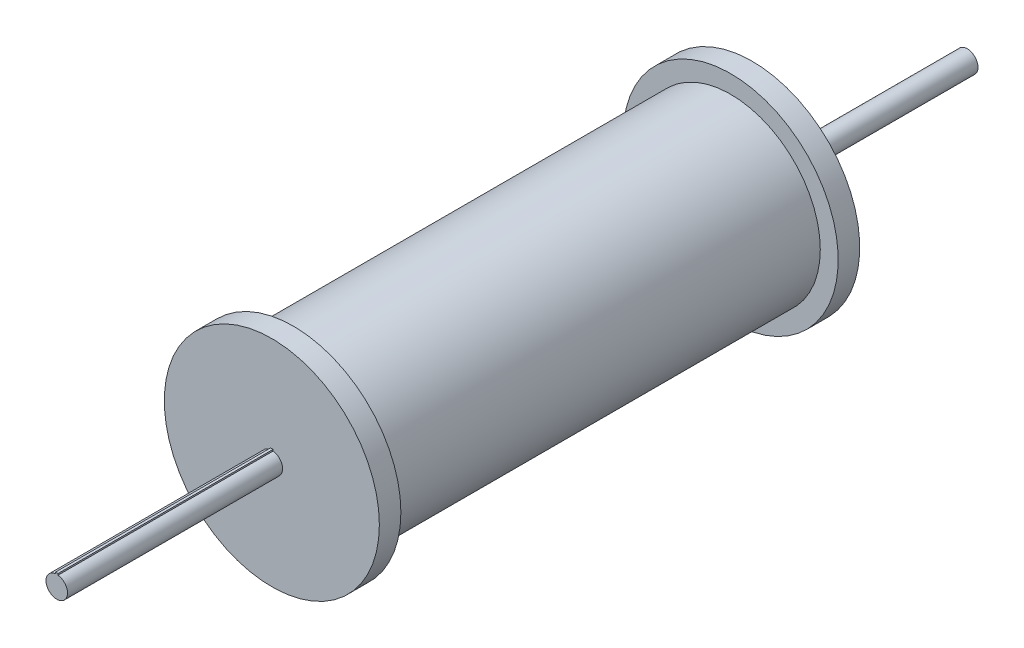
ISO-10303-21;
HEADER;
FILE_DESCRIPTION(('STEP AP214'),'2;1');
FILE_NAME('part.step','',(''),(''),'','','');
FILE_SCHEMA(('AUTOMOTIVE_DESIGN { 1 0 10303 214 1 1 1 1 }'));
ENDSEC;
DATA;
#1=APPLICATION_CONTEXT('core data for automotive mechanical design processes');
#2=APPLICATION_PROTOCOL_DEFINITION('international standard','automotive_design',2000,#1);
#3=PRODUCT_CONTEXT('',#1,'mechanical');
#4=PRODUCT('Part','Part','',(#3));
#5=PRODUCT_RELATED_PRODUCT_CATEGORY('part','',(#4));
#6=PRODUCT_DEFINITION_FORMATION('','',#4);
#7=PRODUCT_DEFINITION_CONTEXT('part definition',#1,'design');
#8=PRODUCT_DEFINITION('design','',#6,#7);
#9=PRODUCT_DEFINITION_SHAPE('','',#8);
#10=(LENGTH_UNIT() NAMED_UNIT(*) SI_UNIT(.MILLI.,.METRE.));
#11=(NAMED_UNIT(*) PLANE_ANGLE_UNIT() SI_UNIT($,.RADIAN.));
#12=(NAMED_UNIT(*) SI_UNIT($,.STERADIAN.) SOLID_ANGLE_UNIT());
#13=UNCERTAINTY_MEASURE_WITH_UNIT(LENGTH_MEASURE(1.E-05),#10,'distance_accuracy_value','');
#14=(GEOMETRIC_REPRESENTATION_CONTEXT(3) GLOBAL_UNCERTAINTY_ASSIGNED_CONTEXT((#13)) GLOBAL_UNIT_ASSIGNED_CONTEXT((#10,
#11,#12)) REPRESENTATION_CONTEXT('',''));
#15=CARTESIAN_POINT('',(0.,0.,0.));
#16=DIRECTION('',(0.,0.,1.));
#17=DIRECTION('',(1.,0.,0.));
#18=AXIS2_PLACEMENT_3D('',#15,#16,#17);
#19=CARTESIAN_POINT('',(0.,0.,3.));
#20=DIRECTION('',(0.,0.,1.));
#21=DIRECTION('',(1.,0.,0.));
#22=AXIS2_PLACEMENT_3D('',#19,#20,#21);
#23=PLANE('',#22);
#24=CARTESIAN_POINT('',(0.,0.,3.));
#25=DIRECTION('',(0.,0.,1.));
#26=DIRECTION('',(1.,0.,0.));
#27=AXIS2_PLACEMENT_3D('',#24,#25,#26);
#28=CIRCLE('',#27,15.);
#29=CARTESIAN_POINT('',(15.,0.,3.));
#30=VERTEX_POINT('',#29);
#31=EDGE_CURVE('E50',#30,#30,#28,.T.);
#32=ORIENTED_EDGE('',*,*,#31,.T.);
#33=EDGE_LOOP('',(#32));
#34=FACE_BOUND('',#33,.T.);
#35=DIRECTION('',(0.,1.,0.));
#36=VECTOR('',#35,1.);
#37=CARTESIAN_POINT('',(0.175,1.69795370368976,3.));
#38=LINE('',#37,#36);
#39=CARTESIAN_POINT('',(0.175,1.48975669154396,3.));
#40=VERTEX_POINT('',#39);
#41=CARTESIAN_POINT('',(0.175,1.69795370368976,3.));
#42=VERTEX_POINT('',#41);
#43=EDGE_CURVE('E99',#40,#42,#38,.T.);
#44=ORIENTED_EDGE('',*,*,#43,.F.);
#45=CARTESIAN_POINT('',(0.,0.,3.));
#46=DIRECTION('',(0.,0.,1.));
#47=DIRECTION('',(1.,0.,0.));
#48=AXIS2_PLACEMENT_3D('',#45,#46,#47);
#49=CIRCLE('',#48,1.5);
#50=CARTESIAN_POINT('',(-0.175,1.48975669154396,3.));
#51=VERTEX_POINT('',#50);
#52=EDGE_CURVE('E110',#51,#40,#49,.T.);
#53=ORIENTED_EDGE('',*,*,#52,.F.);
#54=DIRECTION('',(0.,-1.,0.));
#55=VECTOR('',#54,1.);
#56=CARTESIAN_POINT('',(-0.175,1.48975669154396,3.));
#57=LINE('',#56,#55);
#58=CARTESIAN_POINT('',(-0.175,1.69795370368976,3.));
#59=VERTEX_POINT('',#58);
#60=EDGE_CURVE('E80',#59,#51,#57,.T.);
#61=ORIENTED_EDGE('',*,*,#60,.F.);
#62=DIRECTION('',(-1.,0.,0.));
#63=VECTOR('',#62,1.);
#64=CARTESIAN_POINT('',(-0.175,1.69795370368976,3.));
#65=LINE('',#64,#63);
#66=EDGE_CURVE('E115',#42,#59,#65,.T.);
#67=ORIENTED_EDGE('',*,*,#66,.F.);
#68=EDGE_LOOP('',(#44,#53,#61,#67));
#69=FACE_BOUND('',#68,.T.);
#70=ADVANCED_FACE('F41',(#34,#69),#23,.T.);
#71=CARTESIAN_POINT('',(0.,0.,3.));
#72=DIRECTION('',(0.,0.,-1.));
#73=DIRECTION('',(-1.,0.,0.));
#74=AXIS2_PLACEMENT_3D('',#71,#72,#73);
#75=CYLINDRICAL_SURFACE('',#74,15.);
#76=ORIENTED_EDGE('',*,*,#31,.F.);
#77=EDGE_LOOP('',(#76));
#78=FACE_BOUND('',#77,.T.);
#79=CARTESIAN_POINT('',(0.,0.,0.));
#80=DIRECTION('',(0.,0.,1.));
#81=DIRECTION('',(1.,0.,0.));
#82=AXIS2_PLACEMENT_3D('',#79,#80,#81);
#83=CIRCLE('',#82,15.);
#84=CARTESIAN_POINT('',(15.,0.,0.));
#85=VERTEX_POINT('',#84);
#86=EDGE_CURVE('E45',#85,#85,#83,.T.);
#87=ORIENTED_EDGE('',*,*,#86,.T.);
#88=EDGE_LOOP('',(#87));
#89=FACE_BOUND('',#88,.T.);
#90=ADVANCED_FACE('F43',(#78,#89),#75,.T.);
#91=CARTESIAN_POINT('',(0.,0.,0.));
#92=DIRECTION('',(0.,0.,1.));
#93=DIRECTION('',(1.,0.,0.));
#94=AXIS2_PLACEMENT_3D('',#91,#92,#93);
#95=PLANE('',#94);
#96=CARTESIAN_POINT('',(0.,0.,0.));
#97=DIRECTION('',(0.,0.,-1.));
#98=DIRECTION('',(-1.,0.,0.));
#99=AXIS2_PLACEMENT_3D('',#96,#97,#98);
#100=CIRCLE('',#99,12.5);
#101=CARTESIAN_POINT('',(12.5,0.,0.));
#102=VERTEX_POINT('',#101);
#103=EDGE_CURVE('E11',#102,#102,#100,.T.);
#104=ORIENTED_EDGE('',*,*,#103,.F.);
#105=EDGE_LOOP('',(#104));
#106=FACE_BOUND('',#105,.T.);
#107=ORIENTED_EDGE('',*,*,#86,.F.);
#108=EDGE_LOOP('',(#107));
#109=FACE_BOUND('',#108,.T.);
#110=ADVANCED_FACE('F127',(#106,#109),#95,.F.);
#111=CARTESIAN_POINT('',(0.,0.,33.));
#112=DIRECTION('',(0.,0.,-1.));
#113=DIRECTION('',(-1.,0.,0.));
#114=AXIS2_PLACEMENT_3D('',#111,#112,#113);
#115=CYLINDRICAL_SURFACE('',#114,1.5);
#116=ORIENTED_EDGE('',*,*,#52,.T.);
#117=DIRECTION('',(0.,0.,-1.));
#118=VECTOR('',#117,1.);
#119=CARTESIAN_POINT('',(0.175,1.48975669154396,33.));
#120=LINE('',#119,#118);
#121=CARTESIAN_POINT('',(0.175,1.48975669154396,33.));
#122=VERTEX_POINT('',#121);
#123=EDGE_CURVE('E102',#122,#40,#120,.T.);
#124=ORIENTED_EDGE('',*,*,#123,.F.);
#125=CARTESIAN_POINT('',(0.,0.,33.));
#126=DIRECTION('',(0.,0.,1.));
#127=DIRECTION('',(1.,0.,0.));
#128=AXIS2_PLACEMENT_3D('',#125,#126,#127);
#129=CIRCLE('',#128,1.5);
#130=CARTESIAN_POINT('',(-0.175,1.48975669154396,33.));
#131=VERTEX_POINT('',#130);
#132=EDGE_CURVE('E92',#131,#122,#129,.T.);
#133=ORIENTED_EDGE('',*,*,#132,.F.);
#134=DIRECTION('',(0.,0.,-1.));
#135=VECTOR('',#134,1.);
#136=CARTESIAN_POINT('',(-0.175,1.48975669154396,33.));
#137=LINE('',#136,#135);
#138=EDGE_CURVE('E106',#131,#51,#137,.T.);
#139=ORIENTED_EDGE('',*,*,#138,.T.);
#140=EDGE_LOOP('',(#116,#124,#133,#139));
#141=FACE_BOUND('',#140,.T.);
#142=ADVANCED_FACE('F129',(#141),#115,.T.);
#143=CARTESIAN_POINT('',(0.175,1.69795370368976,33.));
#144=DIRECTION('',(-1.,0.,0.));
#145=DIRECTION('',(0.,-1.,0.));
#146=AXIS2_PLACEMENT_3D('',#143,#144,#145);
#147=PLANE('',#146);
#148=ORIENTED_EDGE('',*,*,#43,.T.);
#149=DIRECTION('',(0.,0.,-1.));
#150=VECTOR('',#149,1.);
#151=CARTESIAN_POINT('',(0.175,1.69795370368976,33.));
#152=LINE('',#151,#150);
#153=CARTESIAN_POINT('',(0.175,1.69795370368976,33.));
#154=VERTEX_POINT('',#153);
#155=EDGE_CURVE('E96',#154,#42,#152,.T.);
#156=ORIENTED_EDGE('',*,*,#155,.F.);
#157=DIRECTION('',(0.,1.,0.));
#158=VECTOR('',#157,1.);
#159=CARTESIAN_POINT('',(0.175,1.69795370368976,33.));
#160=LINE('',#159,#158);
#161=EDGE_CURVE('E87',#122,#154,#160,.T.);
#162=ORIENTED_EDGE('',*,*,#161,.F.);
#163=ORIENTED_EDGE('',*,*,#123,.T.);
#164=EDGE_LOOP('',(#148,#156,#162,#163));
#165=FACE_BOUND('',#164,.T.);
#166=ADVANCED_FACE('F97',(#165),#147,.F.);
#167=CARTESIAN_POINT('',(-0.175,1.69795370368976,33.));
#168=DIRECTION('',(0.,-1.,0.));
#169=DIRECTION('',(0.,0.,-1.));
#170=AXIS2_PLACEMENT_3D('',#167,#168,#169);
#171=PLANE('',#170);
#172=ORIENTED_EDGE('',*,*,#66,.T.);
#173=DIRECTION('',(0.,0.,-1.));
#174=VECTOR('',#173,1.);
#175=CARTESIAN_POINT('',(-0.175,1.69795370368976,33.));
#176=LINE('',#175,#174);
#177=CARTESIAN_POINT('',(-0.175,1.69795370368976,33.));
#178=VERTEX_POINT('',#177);
#179=EDGE_CURVE('E58',#178,#59,#176,.T.);
#180=ORIENTED_EDGE('',*,*,#179,.F.);
#181=DIRECTION('',(-1.,0.,0.));
#182=VECTOR('',#181,1.);
#183=CARTESIAN_POINT('',(-0.175,1.69795370368976,33.));
#184=LINE('',#183,#182);
#185=EDGE_CURVE('E90',#154,#178,#184,.T.);
#186=ORIENTED_EDGE('',*,*,#185,.F.);
#187=ORIENTED_EDGE('',*,*,#155,.T.);
#188=EDGE_LOOP('',(#172,#180,#186,#187));
#189=FACE_BOUND('',#188,.T.);
#190=ADVANCED_FACE('F104',(#189),#171,.F.);
#191=CARTESIAN_POINT('',(-0.175,1.48975669154396,33.));
#192=DIRECTION('',(1.,0.,0.));
#193=DIRECTION('',(0.,0.,-1.));
#194=AXIS2_PLACEMENT_3D('',#191,#192,#193);
#195=PLANE('',#194);
#196=ORIENTED_EDGE('',*,*,#60,.T.);
#197=ORIENTED_EDGE('',*,*,#138,.F.);
#198=DIRECTION('',(0.,-1.,0.));
#199=VECTOR('',#198,1.);
#200=CARTESIAN_POINT('',(-0.175,1.48975669154396,33.));
#201=LINE('',#200,#199);
#202=EDGE_CURVE('E66',#178,#131,#201,.T.);
#203=ORIENTED_EDGE('',*,*,#202,.F.);
#204=ORIENTED_EDGE('',*,*,#179,.T.);
#205=EDGE_LOOP('',(#196,#197,#203,#204));
#206=FACE_BOUND('',#205,.T.);
#207=ADVANCED_FACE('F151',(#206),#195,.F.);
#208=CARTESIAN_POINT('',(0.,0.,33.));
#209=DIRECTION('',(0.,0.,1.));
#210=DIRECTION('',(1.,0.,0.));
#211=AXIS2_PLACEMENT_3D('',#208,#209,#210);
#212=PLANE('',#211);
#213=ORIENTED_EDGE('',*,*,#132,.T.);
#214=ORIENTED_EDGE('',*,*,#161,.T.);
#215=ORIENTED_EDGE('',*,*,#185,.T.);
#216=ORIENTED_EDGE('',*,*,#202,.T.);
#217=EDGE_LOOP('',(#213,#214,#215,#216));
#218=FACE_BOUND('',#217,.T.);
#219=ADVANCED_FACE('F88',(#218),#212,.T.);
#220=CARTESIAN_POINT('',(0.,0.,-61.));
#221=DIRECTION('',(0.,0.,1.));
#222=DIRECTION('',(1.,0.,0.));
#223=AXIS2_PLACEMENT_3D('',#220,#221,#222);
#224=CYLINDRICAL_SURFACE('',#223,12.5);
#225=CARTESIAN_POINT('',(0.,0.,-61.));
#226=DIRECTION('',(0.,0.,-1.));
#227=DIRECTION('',(-1.,0.,0.));
#228=AXIS2_PLACEMENT_3D('',#225,#226,#227);
#229=CIRCLE('',#228,12.5);
#230=CARTESIAN_POINT('',(12.5,0.,-61.));
#231=VERTEX_POINT('',#230);
#232=EDGE_CURVE('E113',#231,#231,#229,.T.);
#233=CARTESIAN_POINT('',(12.5,0.,-61.));
#234=CARTESIAN_POINT('',(12.5,0.,-60.3645833333333));
#235=CARTESIAN_POINT('',(12.5,0.,-59.7291666666667));
#236=CARTESIAN_POINT('',(12.5,0.,-58.4583333333333));
#237=CARTESIAN_POINT('',(12.5,0.,-57.8229166666667));
#238=CARTESIAN_POINT('',(12.5,0.,-56.5520833333333));
#239=CARTESIAN_POINT('',(12.5,0.,-55.9166666666667));
#240=CARTESIAN_POINT('',(12.5,0.,-54.6458333333333));
#241=CARTESIAN_POINT('',(12.5,0.,-54.0104166666667));
#242=CARTESIAN_POINT('',(12.5,0.,-52.7395833333333));
#243=CARTESIAN_POINT('',(12.5,0.,-52.1041666666667));
#244=CARTESIAN_POINT('',(12.5,0.,-50.8333333333333));
#245=CARTESIAN_POINT('',(12.5,0.,-50.1979166666667));
#246=CARTESIAN_POINT('',(12.5,0.,-48.9270833333333));
#247=CARTESIAN_POINT('',(12.5,0.,-48.2916666666667));
#248=CARTESIAN_POINT('',(12.5,0.,-47.0208333333333));
#249=CARTESIAN_POINT('',(12.5,0.,-46.3854166666667));
#250=CARTESIAN_POINT('',(12.5,0.,-45.1145833333333));
#251=CARTESIAN_POINT('',(12.5,0.,-44.4791666666667));
#252=CARTESIAN_POINT('',(12.5,0.,-43.2083333333333));
#253=CARTESIAN_POINT('',(12.5,0.,-42.5729166666667));
#254=CARTESIAN_POINT('',(12.5,0.,-41.3020833333333));
#255=CARTESIAN_POINT('',(12.5,0.,-40.6666666666667));
#256=CARTESIAN_POINT('',(12.5,0.,-39.3958333333333));
#257=CARTESIAN_POINT('',(12.5,0.,-38.7604166666667));
#258=CARTESIAN_POINT('',(12.5,0.,-37.4895833333333));
#259=CARTESIAN_POINT('',(12.5,0.,-36.8541666666667));
#260=CARTESIAN_POINT('',(12.5,0.,-35.5833333333333));
#261=CARTESIAN_POINT('',(12.5,0.,-34.9479166666667));
#262=CARTESIAN_POINT('',(12.5,0.,-33.6770833333333));
#263=CARTESIAN_POINT('',(12.5,0.,-33.0416666666667));
#264=CARTESIAN_POINT('',(12.5,0.,-31.7708333333333));
#265=CARTESIAN_POINT('',(12.5,0.,-31.1354166666667));
#266=CARTESIAN_POINT('',(12.5,0.,-29.8645833333333));
#267=CARTESIAN_POINT('',(12.5,0.,-29.2291666666667));
#268=CARTESIAN_POINT('',(12.5,0.,-27.9583333333333));
#269=CARTESIAN_POINT('',(12.5,0.,-27.3229166666667));
#270=CARTESIAN_POINT('',(12.5,0.,-26.0520833333333));
#271=CARTESIAN_POINT('',(12.5,0.,-25.4166666666667));
#272=CARTESIAN_POINT('',(12.5,0.,-24.1458333333333));
#273=CARTESIAN_POINT('',(12.5,0.,-23.5104166666667));
#274=CARTESIAN_POINT('',(12.5,0.,-22.2395833333333));
#275=CARTESIAN_POINT('',(12.5,0.,-21.6041666666667));
#276=CARTESIAN_POINT('',(12.5,0.,-20.3333333333333));
#277=CARTESIAN_POINT('',(12.5,0.,-19.6979166666667));
#278=CARTESIAN_POINT('',(12.5,0.,-18.4270833333333));
#279=CARTESIAN_POINT('',(12.5,0.,-17.7916666666667));
#280=CARTESIAN_POINT('',(12.5,0.,-16.5208333333333));
#281=CARTESIAN_POINT('',(12.5,0.,-15.8854166666667));
#282=CARTESIAN_POINT('',(12.5,0.,-14.6145833333333));
#283=CARTESIAN_POINT('',(12.5,0.,-13.9791666666667));
#284=CARTESIAN_POINT('',(12.5,0.,-12.7083333333333));
#285=CARTESIAN_POINT('',(12.5,0.,-12.0729166666667));
#286=CARTESIAN_POINT('',(12.5,0.,-10.8020833333333));
#287=CARTESIAN_POINT('',(12.5,0.,-10.1666666666667));
#288=CARTESIAN_POINT('',(12.5,0.,-8.89583333333333));
#289=CARTESIAN_POINT('',(12.5,0.,-8.26041666666666));
#290=CARTESIAN_POINT('',(12.5,0.,-6.98958333333333));
#291=CARTESIAN_POINT('',(12.5,0.,-6.35416666666666));
#292=CARTESIAN_POINT('',(12.5,0.,-5.08333333333333));
#293=CARTESIAN_POINT('',(12.5,0.,-4.44791666666666));
#294=CARTESIAN_POINT('',(12.5,0.,-3.17708333333333));
#295=CARTESIAN_POINT('',(12.5,0.,-2.54166666666666));
#296=CARTESIAN_POINT('',(12.5,0.,-1.27083333333332));
#297=CARTESIAN_POINT('',(12.5,0.,-0.635416666666658));
#298=CARTESIAN_POINT('',(12.5,0.,0.));
#299=B_SPLINE_CURVE_WITH_KNOTS('',3,(#233,#234,#235,#236,#237,#238,#239,#240,#241,#242,#243,
#244,#245,#246,#247,#248,#249,#250,#251,#252,#253,#254,#255,#256,#257,#258,#259,#260,#261,#262,
#263,#264,#265,#266,#267,#268,#269,#270,#271,#272,#273,#274,#275,#276,#277,#278,#279,#280,#281,
#282,#283,#284,#285,#286,#287,#288,#289,#290,#291,#292,#293,#294,#295,#296,#297,#298),
.UNSPECIFIED.,.F.,.F.,(4,2,2,2,2,2,2,2,2,2,2,2,2,2,2,2,2,2,2,2,2,2,2,2,2,2,2,2,2,2,2,2,4),(0.,
1.90625000000001,3.8125,5.71875,7.62500000000001,9.53125000000001,11.4375,13.34375,15.25,
17.15625,19.0625,20.96875,22.875,24.78125,26.6875,28.59375,30.5,32.40625,34.3125,36.21875,
38.125,40.03125,41.9375,43.84375,45.75,47.65625,49.5625,51.46875,53.375,55.28125,57.1875,
59.09375,61.),.UNSPECIFIED.);
#300=EDGE_CURVE('BSEAM155',#231,#102,#299,.T.);
#301=ORIENTED_EDGE('',*,*,#232,.F.);
#302=ORIENTED_EDGE('',*,*,#103,.T.);
#303=ORIENTED_EDGE('',*,*,#300,.T.);
#304=ORIENTED_EDGE('',*,*,#300,.F.);
#305=EDGE_LOOP('',(#301,#303,#302,#304));
#306=FACE_BOUND('',#305,.T.);
#307=ADVANCED_FACE('F155',(#306),#224,.T.);
#308=CARTESIAN_POINT('',(0.,0.,-64.));
#309=DIRECTION('',(0.,0.,1.));
#310=DIRECTION('',(1.,0.,0.));
#311=AXIS2_PLACEMENT_3D('',#308,#309,#310);
#312=CYLINDRICAL_SURFACE('',#311,15.);
#313=CARTESIAN_POINT('',(0.,0.,-64.));
#314=DIRECTION('',(0.,0.,-1.));
#315=DIRECTION('',(-1.,0.,0.));
#316=AXIS2_PLACEMENT_3D('',#313,#314,#315);
#317=CIRCLE('',#316,15.);
#318=CARTESIAN_POINT('',(-15.,0.,-64.));
#319=VERTEX_POINT('',#318);
#320=EDGE_CURVE('E186',#319,#319,#317,.T.);
#321=ORIENTED_EDGE('',*,*,#320,.F.);
#322=EDGE_LOOP('',(#321));
#323=FACE_BOUND('',#322,.T.);
#324=CARTESIAN_POINT('',(0.,0.,-61.));
#325=DIRECTION('',(0.,0.,-1.));
#326=DIRECTION('',(-1.,0.,0.));
#327=AXIS2_PLACEMENT_3D('',#324,#325,#326);
#328=CIRCLE('',#327,15.);
#329=CARTESIAN_POINT('',(-15.,0.,-61.));
#330=VERTEX_POINT('',#329);
#331=EDGE_CURVE('E182',#330,#330,#328,.T.);
#332=ORIENTED_EDGE('',*,*,#331,.T.);
#333=EDGE_LOOP('',(#332));
#334=FACE_BOUND('',#333,.T.);
#335=ADVANCED_FACE('F157',(#323,#334),#312,.T.);
#336=CARTESIAN_POINT('',(0.,0.,-64.));
#337=DIRECTION('',(0.,0.,-1.));
#338=DIRECTION('',(-1.,0.,0.));
#339=AXIS2_PLACEMENT_3D('',#336,#337,#338);
#340=PLANE('',#339);
#341=CARTESIAN_POINT('',(0.,0.,-64.));
#342=DIRECTION('',(0.,0.,-1.));
#343=DIRECTION('',(-1.,0.,0.));
#344=AXIS2_PLACEMENT_3D('',#341,#342,#343);
#345=CIRCLE('',#344,1.5);
#346=CARTESIAN_POINT('',(-1.5,0.,-64.));
#347=VERTEX_POINT('',#346);
#348=EDGE_CURVE('E183',#347,#347,#345,.T.);
#349=ORIENTED_EDGE('',*,*,#348,.F.);
#350=EDGE_LOOP('',(#349));
#351=FACE_BOUND('',#350,.T.);
#352=ORIENTED_EDGE('',*,*,#320,.T.);
#353=EDGE_LOOP('',(#352));
#354=FACE_BOUND('',#353,.T.);
#355=ADVANCED_FACE('F161',(#351,#354),#340,.T.);
#356=CARTESIAN_POINT('',(0.,0.,-61.));
#357=DIRECTION('',(0.,0.,-1.));
#358=DIRECTION('',(-1.,0.,0.));
#359=AXIS2_PLACEMENT_3D('',#356,#357,#358);
#360=PLANE('',#359);
#361=ORIENTED_EDGE('',*,*,#232,.T.);
#362=EDGE_LOOP('',(#361));
#363=FACE_BOUND('',#362,.T.);
#364=ORIENTED_EDGE('',*,*,#331,.F.);
#365=EDGE_LOOP('',(#364));
#366=FACE_BOUND('',#365,.T.);
#367=ADVANCED_FACE('F163',(#363,#366),#360,.F.);
#368=CARTESIAN_POINT('',(0.,0.,-94.));
#369=DIRECTION('',(0.,0.,1.));
#370=DIRECTION('',(1.,0.,0.));
#371=AXIS2_PLACEMENT_3D('',#368,#369,#370);
#372=CYLINDRICAL_SURFACE('',#371,1.5);
#373=CARTESIAN_POINT('',(0.,0.,-94.));
#374=DIRECTION('',(0.,0.,-1.));
#375=DIRECTION('',(-1.,0.,0.));
#376=AXIS2_PLACEMENT_3D('',#373,#374,#375);
#377=CIRCLE('',#376,1.5);
#378=CARTESIAN_POINT('',(-1.5,0.,-94.));
#379=VERTEX_POINT('',#378);
#380=EDGE_CURVE('E181',#379,#379,#377,.T.);
#381=ORIENTED_EDGE('',*,*,#380,.F.);
#382=EDGE_LOOP('',(#381));
#383=FACE_BOUND('',#382,.T.);
#384=ORIENTED_EDGE('',*,*,#348,.T.);
#385=EDGE_LOOP('',(#384));
#386=FACE_BOUND('',#385,.T.);
#387=ADVANCED_FACE('F166',(#383,#386),#372,.T.);
#388=CARTESIAN_POINT('',(0.,0.,-94.));
#389=DIRECTION('',(0.,0.,-1.));
#390=DIRECTION('',(-1.,0.,0.));
#391=AXIS2_PLACEMENT_3D('',#388,#389,#390);
#392=PLANE('',#391);
#393=ORIENTED_EDGE('',*,*,#380,.T.);
#394=EDGE_LOOP('',(#393));
#395=FACE_BOUND('',#394,.T.);
#396=ADVANCED_FACE('F173',(#395),#392,.T.);
#397=CLOSED_SHELL('',(#70,#90,#110,#142,#166,#190,#207,#219,#307,#335,#355,#367,#387,#396));
#398=MANIFOLD_SOLID_BREP('B2',#397);
#399=ADVANCED_BREP_SHAPE_REPRESENTATION('',(#18,#398),#14);
#400=SHAPE_DEFINITION_REPRESENTATION(#9,#399);
ENDSEC;
END-ISO-10303-21;
